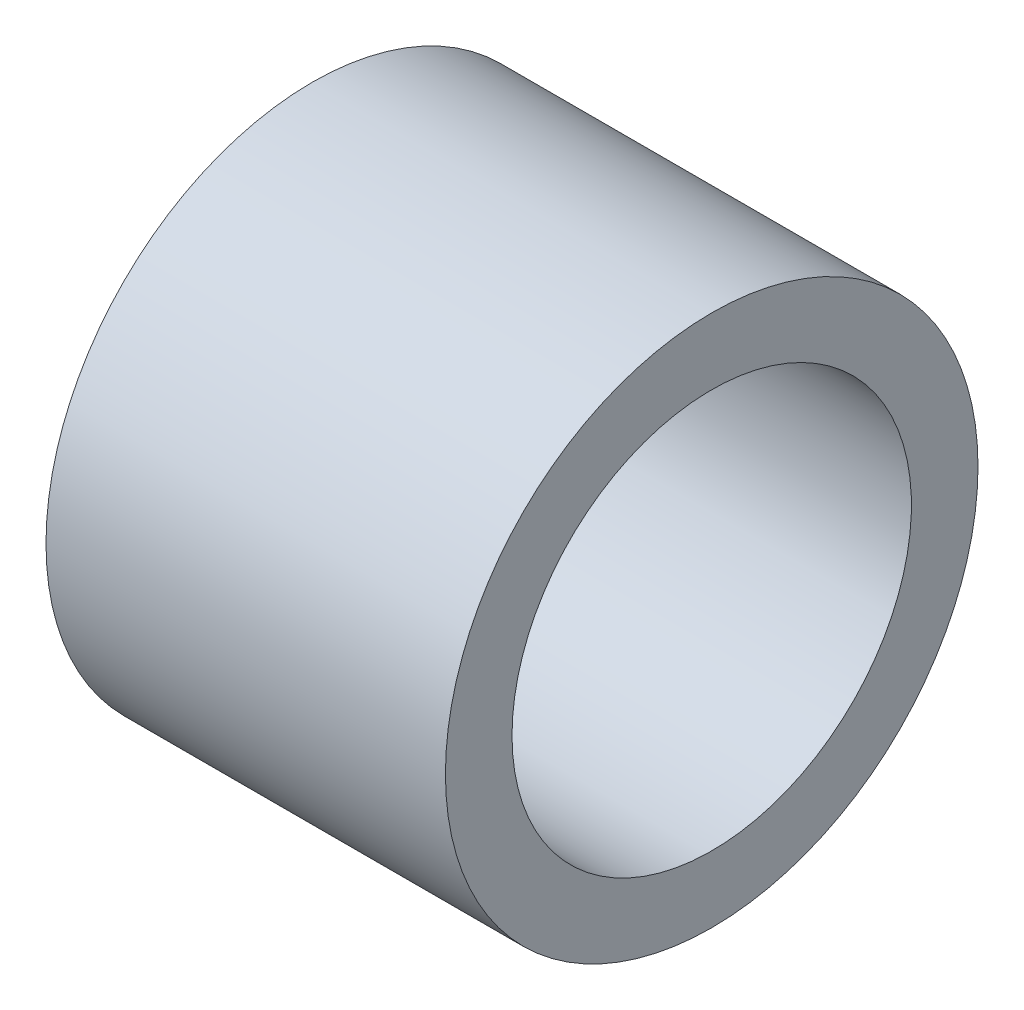
ISO-10303-21;
HEADER;
FILE_DESCRIPTION(('STEP AP214'),'2;1');
FILE_NAME('part.step','',(''),(''),'','','');
FILE_SCHEMA(('AUTOMOTIVE_DESIGN { 1 0 10303 214 1 1 1 1 }'));
ENDSEC;
DATA;
#1=APPLICATION_CONTEXT('core data for automotive mechanical design processes');
#2=APPLICATION_PROTOCOL_DEFINITION('international standard','automotive_design',2000,#1);
#3=PRODUCT_CONTEXT('',#1,'mechanical');
#4=PRODUCT('Part','Part','',(#3));
#5=PRODUCT_RELATED_PRODUCT_CATEGORY('part','',(#4));
#6=PRODUCT_DEFINITION_FORMATION('','',#4);
#7=PRODUCT_DEFINITION_CONTEXT('part definition',#1,'design');
#8=PRODUCT_DEFINITION('design','',#6,#7);
#9=PRODUCT_DEFINITION_SHAPE('','',#8);
#10=(LENGTH_UNIT() NAMED_UNIT(*) SI_UNIT(.MILLI.,.METRE.));
#11=(NAMED_UNIT(*) PLANE_ANGLE_UNIT() SI_UNIT($,.RADIAN.));
#12=(NAMED_UNIT(*) SI_UNIT($,.STERADIAN.) SOLID_ANGLE_UNIT());
#13=UNCERTAINTY_MEASURE_WITH_UNIT(LENGTH_MEASURE(1.E-05),#10,'distance_accuracy_value','');
#14=(GEOMETRIC_REPRESENTATION_CONTEXT(3) GLOBAL_UNCERTAINTY_ASSIGNED_CONTEXT((#13)) GLOBAL_UNIT_ASSIGNED_CONTEXT((#10,
#11,#12)) REPRESENTATION_CONTEXT('',''));
#15=CARTESIAN_POINT('',(0.,0.,0.));
#16=DIRECTION('',(0.,0.,1.));
#17=DIRECTION('',(1.,0.,0.));
#18=AXIS2_PLACEMENT_3D('',#15,#16,#17);
#19=CARTESIAN_POINT('',(19.05,0.,0.));
#20=DIRECTION('',(1.,0.,0.));
#21=DIRECTION('',(0.,0.,-1.));
#22=AXIS2_PLACEMENT_3D('',#19,#20,#21);
#23=PLANE('',#22);
#24=CARTESIAN_POINT('',(19.05,0.,0.));
#25=DIRECTION('',(1.,0.,0.));
#26=DIRECTION('',(0.,0.,-1.));
#27=AXIS2_PLACEMENT_3D('',#24,#25,#26);
#28=CIRCLE('',#27,12.7);
#29=CARTESIAN_POINT('',(19.05,0.,12.7));
#30=VERTEX_POINT('',#29);
#31=EDGE_CURVE('E10',#30,#30,#28,.T.);
#32=ORIENTED_EDGE('',*,*,#31,.T.);
#33=EDGE_LOOP('',(#32));
#34=FACE_BOUND('',#33,.T.);
#35=CARTESIAN_POINT('',(19.05,0.,0.));
#36=DIRECTION('',(1.,0.,0.));
#37=DIRECTION('',(0.,0.,-1.));
#38=AXIS2_PLACEMENT_3D('',#35,#36,#37);
#39=CIRCLE('',#38,9.525);
#40=CARTESIAN_POINT('',(19.05,0.,9.525));
#41=VERTEX_POINT('',#40);
#42=EDGE_CURVE('E56',#41,#41,#39,.T.);
#43=ORIENTED_EDGE('',*,*,#42,.F.);
#44=EDGE_LOOP('',(#43));
#45=FACE_BOUND('',#44,.T.);
#46=ADVANCED_FACE('F43',(#34,#45),#23,.T.);
#47=CARTESIAN_POINT('',(0.,0.,0.));
#48=DIRECTION('',(1.,0.,0.));
#49=DIRECTION('',(0.,0.,-1.));
#50=AXIS2_PLACEMENT_3D('',#47,#48,#49);
#51=PLANE('',#50);
#52=CARTESIAN_POINT('',(0.,0.,0.));
#53=DIRECTION('',(1.,0.,0.));
#54=DIRECTION('',(0.,0.,-1.));
#55=AXIS2_PLACEMENT_3D('',#52,#53,#54);
#56=CIRCLE('',#55,12.7);
#57=CARTESIAN_POINT('',(0.,0.,12.7));
#58=VERTEX_POINT('',#57);
#59=EDGE_CURVE('E47',#58,#58,#56,.T.);
#60=ORIENTED_EDGE('',*,*,#59,.F.);
#61=EDGE_LOOP('',(#60));
#62=FACE_BOUND('',#61,.T.);
#63=CARTESIAN_POINT('',(0.,0.,0.));
#64=DIRECTION('',(1.,0.,0.));
#65=DIRECTION('',(0.,0.,-1.));
#66=AXIS2_PLACEMENT_3D('',#63,#64,#65);
#67=CIRCLE('',#66,9.525);
#68=CARTESIAN_POINT('',(0.,0.,9.525));
#69=VERTEX_POINT('',#68);
#70=EDGE_CURVE('E58',#69,#69,#67,.T.);
#71=ORIENTED_EDGE('',*,*,#70,.T.);
#72=EDGE_LOOP('',(#71));
#73=FACE_BOUND('',#72,.T.);
#74=ADVANCED_FACE('F70',(#62,#73),#51,.F.);
#75=CARTESIAN_POINT('',(19.05,0.,0.));
#76=DIRECTION('',(-1.,0.,0.));
#77=DIRECTION('',(0.,0.,1.));
#78=AXIS2_PLACEMENT_3D('',#75,#76,#77);
#79=CYLINDRICAL_SURFACE('',#78,12.7);
#80=CARTESIAN_POINT('',(19.05,0.,12.7));
#81=CARTESIAN_POINT('',(18.8515625,0.,12.7));
#82=CARTESIAN_POINT('',(18.653125,0.,12.7));
#83=CARTESIAN_POINT('',(18.25625,0.,12.7));
#84=CARTESIAN_POINT('',(18.0578125,0.,12.7));
#85=CARTESIAN_POINT('',(17.6609375,0.,12.7));
#86=CARTESIAN_POINT('',(17.4625,0.,12.7));
#87=CARTESIAN_POINT('',(17.065625,0.,12.7));
#88=CARTESIAN_POINT('',(16.8671875,0.,12.7));
#89=CARTESIAN_POINT('',(16.4703125,0.,12.7));
#90=CARTESIAN_POINT('',(16.271875,0.,12.7));
#91=CARTESIAN_POINT('',(15.875,0.,12.7));
#92=CARTESIAN_POINT('',(15.6765625,0.,12.7));
#93=CARTESIAN_POINT('',(15.2796875,0.,12.7));
#94=CARTESIAN_POINT('',(15.08125,0.,12.7));
#95=CARTESIAN_POINT('',(14.684375,0.,12.7));
#96=CARTESIAN_POINT('',(14.4859375,0.,12.7));
#97=CARTESIAN_POINT('',(14.0890625,0.,12.7));
#98=CARTESIAN_POINT('',(13.890625,0.,12.7));
#99=CARTESIAN_POINT('',(13.49375,0.,12.7));
#100=CARTESIAN_POINT('',(13.2953125,0.,12.7));
#101=CARTESIAN_POINT('',(12.8984375,0.,12.7));
#102=CARTESIAN_POINT('',(12.7,0.,12.7));
#103=CARTESIAN_POINT('',(12.303125,0.,12.7));
#104=CARTESIAN_POINT('',(12.1046875,0.,12.7));
#105=CARTESIAN_POINT('',(11.7078125,0.,12.7));
#106=CARTESIAN_POINT('',(11.509375,0.,12.7));
#107=CARTESIAN_POINT('',(11.1125,0.,12.7));
#108=CARTESIAN_POINT('',(10.9140625,0.,12.7));
#109=CARTESIAN_POINT('',(10.5171875,0.,12.7));
#110=CARTESIAN_POINT('',(10.31875,0.,12.7));
#111=CARTESIAN_POINT('',(9.921875,0.,12.7));
#112=CARTESIAN_POINT('',(9.7234375,0.,12.7));
#113=CARTESIAN_POINT('',(9.3265625,0.,12.7));
#114=CARTESIAN_POINT('',(9.128125,0.,12.7));
#115=CARTESIAN_POINT('',(8.73125,0.,12.7));
#116=CARTESIAN_POINT('',(8.5328125,0.,12.7));
#117=CARTESIAN_POINT('',(8.1359375,0.,12.7));
#118=CARTESIAN_POINT('',(7.9375,0.,12.7));
#119=CARTESIAN_POINT('',(7.540625,0.,12.7));
#120=CARTESIAN_POINT('',(7.3421875,0.,12.7));
#121=CARTESIAN_POINT('',(6.9453125,0.,12.7));
#122=CARTESIAN_POINT('',(6.746875,0.,12.7));
#123=CARTESIAN_POINT('',(6.35,0.,12.7));
#124=CARTESIAN_POINT('',(6.1515625,0.,12.7));
#125=CARTESIAN_POINT('',(5.7546875,0.,12.7));
#126=CARTESIAN_POINT('',(5.55625,0.,12.7));
#127=CARTESIAN_POINT('',(5.159375,0.,12.7));
#128=CARTESIAN_POINT('',(4.9609375,0.,12.7));
#129=CARTESIAN_POINT('',(4.5640625,0.,12.7));
#130=CARTESIAN_POINT('',(4.365625,0.,12.7));
#131=CARTESIAN_POINT('',(3.96875,0.,12.7));
#132=CARTESIAN_POINT('',(3.7703125,0.,12.7));
#133=CARTESIAN_POINT('',(3.3734375,0.,12.7));
#134=CARTESIAN_POINT('',(3.175,0.,12.7));
#135=CARTESIAN_POINT('',(2.778125,0.,12.7));
#136=CARTESIAN_POINT('',(2.5796875,0.,12.7));
#137=CARTESIAN_POINT('',(2.1828125,0.,12.7));
#138=CARTESIAN_POINT('',(1.984375,0.,12.7));
#139=CARTESIAN_POINT('',(1.5875,0.,12.7));
#140=CARTESIAN_POINT('',(1.3890625,0.,12.7));
#141=CARTESIAN_POINT('',(0.992187500000001,0.,12.7));
#142=CARTESIAN_POINT('',(0.793750000000001,0.,12.7));
#143=CARTESIAN_POINT('',(0.396875,0.,12.7));
#144=CARTESIAN_POINT('',(0.1984375,0.,12.7));
#145=CARTESIAN_POINT('',(0.,0.,12.7));
#146=B_SPLINE_CURVE_WITH_KNOTS('',3,(#80,#81,#82,#83,#84,#85,#86,#87,#88,#89,#90,#91,#92,#93,
#94,#95,#96,#97,#98,#99,#100,#101,#102,#103,#104,#105,#106,#107,#108,#109,#110,#111,#112,#113,
#114,#115,#116,#117,#118,#119,#120,#121,#122,#123,#124,#125,#126,#127,#128,#129,#130,#131,#132,
#133,#134,#135,#136,#137,#138,#139,#140,#141,#142,#143,#144,#145),.UNSPECIFIED.,.F.,.F.,(4,2,2,
2,2,2,2,2,2,2,2,2,2,2,2,2,2,2,2,2,2,2,2,2,2,2,2,2,2,2,2,2,4),(0.,0.595312499999997,1.190625,
1.7859375,2.38125,2.9765625,3.571875,4.1671875,4.7625,5.3578125,5.953125,6.5484375,7.14375,
7.7390625,8.334375,8.9296875,9.525,10.1203125,10.715625,11.3109375,11.90625,12.5015625,
13.096875,13.6921875,14.2875,14.8828125,15.478125,16.0734375,16.66875,17.2640625,17.859375,
18.4546875,19.05),.UNSPECIFIED.);
#147=EDGE_CURVE('BSEAM45',#30,#58,#146,.T.);
#148=ORIENTED_EDGE('',*,*,#31,.F.);
#149=ORIENTED_EDGE('',*,*,#59,.T.);
#150=ORIENTED_EDGE('',*,*,#147,.T.);
#151=ORIENTED_EDGE('',*,*,#147,.F.);
#152=EDGE_LOOP('',(#148,#150,#149,#151));
#153=FACE_BOUND('',#152,.T.);
#154=ADVANCED_FACE('F45',(#153),#79,.T.);
#155=CARTESIAN_POINT('',(19.05,0.,0.));
#156=DIRECTION('',(-1.,0.,0.));
#157=DIRECTION('',(0.,0.,1.));
#158=AXIS2_PLACEMENT_3D('',#155,#156,#157);
#159=CYLINDRICAL_SURFACE('',#158,9.525);
#160=CARTESIAN_POINT('',(19.05,0.,9.525));
#161=CARTESIAN_POINT('',(18.8515625,0.,9.525));
#162=CARTESIAN_POINT('',(18.653125,0.,9.525));
#163=CARTESIAN_POINT('',(18.25625,0.,9.525));
#164=CARTESIAN_POINT('',(18.0578125,0.,9.525));
#165=CARTESIAN_POINT('',(17.6609375,0.,9.525));
#166=CARTESIAN_POINT('',(17.4625,0.,9.525));
#167=CARTESIAN_POINT('',(17.065625,0.,9.525));
#168=CARTESIAN_POINT('',(16.8671875,0.,9.525));
#169=CARTESIAN_POINT('',(16.4703125,0.,9.525));
#170=CARTESIAN_POINT('',(16.271875,0.,9.525));
#171=CARTESIAN_POINT('',(15.875,0.,9.525));
#172=CARTESIAN_POINT('',(15.6765625,0.,9.525));
#173=CARTESIAN_POINT('',(15.2796875,0.,9.525));
#174=CARTESIAN_POINT('',(15.08125,0.,9.525));
#175=CARTESIAN_POINT('',(14.684375,0.,9.525));
#176=CARTESIAN_POINT('',(14.4859375,0.,9.525));
#177=CARTESIAN_POINT('',(14.0890625,0.,9.525));
#178=CARTESIAN_POINT('',(13.890625,0.,9.525));
#179=CARTESIAN_POINT('',(13.49375,0.,9.525));
#180=CARTESIAN_POINT('',(13.2953125,0.,9.525));
#181=CARTESIAN_POINT('',(12.8984375,0.,9.525));
#182=CARTESIAN_POINT('',(12.7,0.,9.525));
#183=CARTESIAN_POINT('',(12.303125,0.,9.525));
#184=CARTESIAN_POINT('',(12.1046875,0.,9.525));
#185=CARTESIAN_POINT('',(11.7078125,0.,9.525));
#186=CARTESIAN_POINT('',(11.509375,0.,9.525));
#187=CARTESIAN_POINT('',(11.1125,0.,9.525));
#188=CARTESIAN_POINT('',(10.9140625,0.,9.525));
#189=CARTESIAN_POINT('',(10.5171875,0.,9.525));
#190=CARTESIAN_POINT('',(10.31875,0.,9.525));
#191=CARTESIAN_POINT('',(9.921875,0.,9.525));
#192=CARTESIAN_POINT('',(9.7234375,0.,9.525));
#193=CARTESIAN_POINT('',(9.3265625,0.,9.525));
#194=CARTESIAN_POINT('',(9.128125,0.,9.525));
#195=CARTESIAN_POINT('',(8.73125,0.,9.525));
#196=CARTESIAN_POINT('',(8.5328125,0.,9.525));
#197=CARTESIAN_POINT('',(8.1359375,0.,9.525));
#198=CARTESIAN_POINT('',(7.9375,0.,9.525));
#199=CARTESIAN_POINT('',(7.540625,0.,9.525));
#200=CARTESIAN_POINT('',(7.3421875,0.,9.525));
#201=CARTESIAN_POINT('',(6.9453125,0.,9.525));
#202=CARTESIAN_POINT('',(6.746875,0.,9.525));
#203=CARTESIAN_POINT('',(6.35,0.,9.525));
#204=CARTESIAN_POINT('',(6.1515625,0.,9.525));
#205=CARTESIAN_POINT('',(5.7546875,0.,9.525));
#206=CARTESIAN_POINT('',(5.55625,0.,9.525));
#207=CARTESIAN_POINT('',(5.159375,0.,9.525));
#208=CARTESIAN_POINT('',(4.9609375,0.,9.525));
#209=CARTESIAN_POINT('',(4.5640625,0.,9.525));
#210=CARTESIAN_POINT('',(4.365625,0.,9.525));
#211=CARTESIAN_POINT('',(3.96875,0.,9.525));
#212=CARTESIAN_POINT('',(3.7703125,0.,9.525));
#213=CARTESIAN_POINT('',(3.3734375,0.,9.525));
#214=CARTESIAN_POINT('',(3.175,0.,9.525));
#215=CARTESIAN_POINT('',(2.778125,0.,9.525));
#216=CARTESIAN_POINT('',(2.5796875,0.,9.525));
#217=CARTESIAN_POINT('',(2.1828125,0.,9.525));
#218=CARTESIAN_POINT('',(1.984375,0.,9.525));
#219=CARTESIAN_POINT('',(1.5875,0.,9.525));
#220=CARTESIAN_POINT('',(1.3890625,0.,9.525));
#221=CARTESIAN_POINT('',(0.992187500000001,0.,9.525));
#222=CARTESIAN_POINT('',(0.793750000000001,0.,9.525));
#223=CARTESIAN_POINT('',(0.396875,0.,9.525));
#224=CARTESIAN_POINT('',(0.1984375,0.,9.525));
#225=CARTESIAN_POINT('',(0.,0.,9.525));
#226=B_SPLINE_CURVE_WITH_KNOTS('',3,(#160,#161,#162,#163,#164,#165,#166,#167,#168,#169,#170,
#171,#172,#173,#174,#175,#176,#177,#178,#179,#180,#181,#182,#183,#184,#185,#186,#187,#188,#189,
#190,#191,#192,#193,#194,#195,#196,#197,#198,#199,#200,#201,#202,#203,#204,#205,#206,#207,#208,
#209,#210,#211,#212,#213,#214,#215,#216,#217,#218,#219,#220,#221,#222,#223,#224,#225),
.UNSPECIFIED.,.F.,.F.,(4,2,2,2,2,2,2,2,2,2,2,2,2,2,2,2,2,2,2,2,2,2,2,2,2,2,2,2,2,2,2,2,4),(0.,
0.5953125,1.190625,1.7859375,2.38125,2.9765625,3.571875,4.1671875,4.7625,5.3578125,5.953125,
6.5484375,7.14375,7.7390625,8.334375,8.9296875,9.525,10.1203125,10.715625,11.3109375,11.90625,
12.5015625,13.096875,13.6921875,14.2875,14.8828125,15.478125,16.0734375,16.66875,17.2640625,
17.859375,18.4546875,19.05),.UNSPECIFIED.);
#227=EDGE_CURVE('BSEAM66',#41,#69,#226,.T.);
#228=ORIENTED_EDGE('',*,*,#42,.T.);
#229=ORIENTED_EDGE('',*,*,#70,.F.);
#230=ORIENTED_EDGE('',*,*,#227,.T.);
#231=ORIENTED_EDGE('',*,*,#227,.F.);
#232=EDGE_LOOP('',(#228,#230,#229,#231));
#233=FACE_BOUND('',#232,.T.);
#234=ADVANCED_FACE('F66',(#233),#159,.F.);
#235=CLOSED_SHELL('',(#46,#74,#154,#234));
#236=MANIFOLD_SOLID_BREP('B2',#235);
#237=ADVANCED_BREP_SHAPE_REPRESENTATION('',(#18,#236),#14);
#238=SHAPE_DEFINITION_REPRESENTATION(#9,#237);
ENDSEC;
END-ISO-10303-21;
